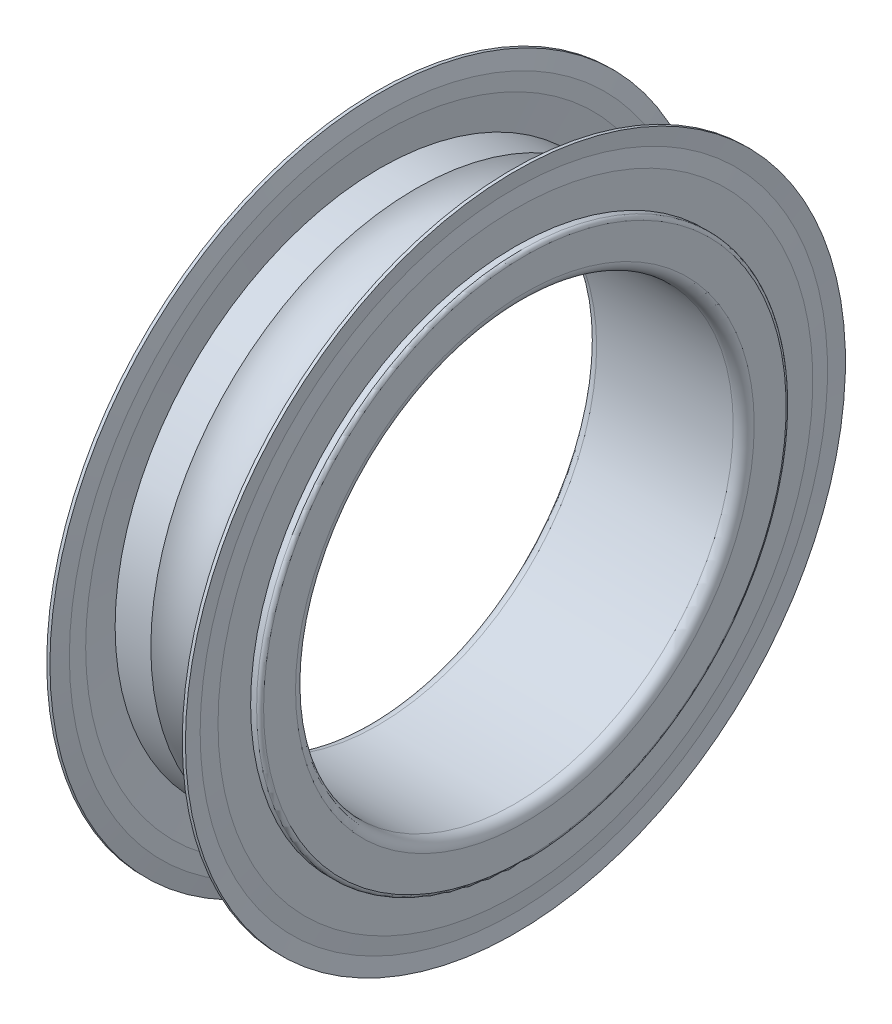
ISO-10303-21;
HEADER;
FILE_DESCRIPTION(('STEP AP214'),'2;1');
FILE_NAME('part.step','',(''),(''),'','','');
FILE_SCHEMA(('AUTOMOTIVE_DESIGN { 1 0 10303 214 1 1 1 1 }'));
ENDSEC;
DATA;
#1=APPLICATION_CONTEXT('core data for automotive mechanical design processes');
#2=APPLICATION_PROTOCOL_DEFINITION('international standard','automotive_design',2000,#1);
#3=PRODUCT_CONTEXT('',#1,'mechanical');
#4=PRODUCT('Part','Part','',(#3));
#5=PRODUCT_RELATED_PRODUCT_CATEGORY('part','',(#4));
#6=PRODUCT_DEFINITION_FORMATION('','',#4);
#7=PRODUCT_DEFINITION_CONTEXT('part definition',#1,'design');
#8=PRODUCT_DEFINITION('design','',#6,#7);
#9=PRODUCT_DEFINITION_SHAPE('','',#8);
#10=(LENGTH_UNIT() NAMED_UNIT(*) SI_UNIT(.MILLI.,.METRE.));
#11=(NAMED_UNIT(*) PLANE_ANGLE_UNIT() SI_UNIT($,.RADIAN.));
#12=(NAMED_UNIT(*) SI_UNIT($,.STERADIAN.) SOLID_ANGLE_UNIT());
#13=UNCERTAINTY_MEASURE_WITH_UNIT(LENGTH_MEASURE(1.E-05),#10,'distance_accuracy_value','');
#14=(GEOMETRIC_REPRESENTATION_CONTEXT(3) GLOBAL_UNCERTAINTY_ASSIGNED_CONTEXT((#13)) GLOBAL_UNIT_ASSIGNED_CONTEXT((#10,
#11,#12)) REPRESENTATION_CONTEXT('',''));
#15=CARTESIAN_POINT('',(0.,0.,0.));
#16=DIRECTION('',(0.,0.,1.));
#17=DIRECTION('',(1.,0.,0.));
#18=AXIS2_PLACEMENT_3D('',#15,#16,#17);
#19=CARTESIAN_POINT('',(50.,0.,0.));
#20=DIRECTION('',(-1.,0.,0.));
#21=DIRECTION('',(0.,0.,1.));
#22=AXIS2_PLACEMENT_3D('',#19,#20,#21);
#23=CYLINDRICAL_SURFACE('',#22,15.125);
#24=CARTESIAN_POINT('',(6.2402689447324,0.,0.));
#25=DIRECTION('',(-1.,0.,0.));
#26=DIRECTION('',(0.,0.,1.));
#27=AXIS2_PLACEMENT_3D('',#24,#25,#26);
#28=CIRCLE('',#27,15.125);
#29=CARTESIAN_POINT('',(6.2402689447324,0.,15.125));
#30=VERTEX_POINT('',#29);
#31=EDGE_CURVE('E76',#30,#30,#28,.T.);
#32=ORIENTED_EDGE('',*,*,#31,.F.);
#33=EDGE_LOOP('',(#32));
#34=FACE_BOUND('',#33,.T.);
#35=CARTESIAN_POINT('',(8.28,0.,0.));
#36=DIRECTION('',(-1.,0.,0.));
#37=DIRECTION('',(0.,0.,1.));
#38=AXIS2_PLACEMENT_3D('',#35,#36,#37);
#39=CIRCLE('',#38,15.125);
#40=CARTESIAN_POINT('',(8.28,0.,15.125));
#41=VERTEX_POINT('',#40);
#42=EDGE_CURVE('E10',#41,#41,#39,.F.);
#43=ORIENTED_EDGE('',*,*,#42,.F.);
#44=EDGE_LOOP('',(#43));
#45=FACE_BOUND('',#44,.T.);
#46=ADVANCED_FACE('F35',(#34,#45),#23,.T.);
#47=CARTESIAN_POINT('',(8.8,0.,0.));
#48=DIRECTION('',(-1.,0.,0.));
#49=DIRECTION('',(0.,0.,1.));
#50=AXIS2_PLACEMENT_3D('',#47,#48,#49);
#51=CIRCLE('',#50,15.125);
#52=CARTESIAN_POINT('',(8.8,0.,15.125));
#53=VERTEX_POINT('',#52);
#54=EDGE_CURVE('E73',#53,#53,#51,.T.);
#55=ORIENTED_EDGE('',*,*,#54,.T.);
#56=EDGE_LOOP('',(#55));
#57=FACE_BOUND('',#56,.T.);
#58=CARTESIAN_POINT('',(8.46,0.,0.));
#59=DIRECTION('',(-1.,0.,0.));
#60=DIRECTION('',(0.,0.,1.));
#61=AXIS2_PLACEMENT_3D('',#58,#59,#60);
#62=CIRCLE('',#61,15.125);
#63=CARTESIAN_POINT('',(8.46,0.,15.125));
#64=VERTEX_POINT('',#63);
#65=EDGE_CURVE('E42',#64,#64,#62,.T.);
#66=ORIENTED_EDGE('',*,*,#65,.F.);
#67=EDGE_LOOP('',(#66));
#68=FACE_BOUND('',#67,.T.);
#69=ADVANCED_FACE('F157',(#57,#68),#23,.T.);
#70=CARTESIAN_POINT('',(50.,0.,0.));
#71=DIRECTION('',(-1.,0.,0.));
#72=DIRECTION('',(0.,0.,1.));
#73=AXIS2_PLACEMENT_3D('',#70,#71,#72);
#74=CYLINDRICAL_SURFACE('',#73,15.125);
#75=CARTESIAN_POINT('',(0.199999999999999,0.,0.));
#76=DIRECTION('',(-1.,0.,0.));
#77=DIRECTION('',(0.,0.,1.));
#78=AXIS2_PLACEMENT_3D('',#75,#76,#77);
#79=CIRCLE('',#78,15.125);
#80=CARTESIAN_POINT('',(0.199999999999999,0.,15.125));
#81=VERTEX_POINT('',#80);
#82=EDGE_CURVE('E82',#81,#81,#79,.T.);
#83=ORIENTED_EDGE('',*,*,#82,.F.);
#84=EDGE_LOOP('',(#83));
#85=FACE_BOUND('',#84,.T.);
#86=CARTESIAN_POINT('',(0.539999999999999,0.,0.));
#87=DIRECTION('',(1.,0.,0.));
#88=DIRECTION('',(0.,0.,-1.));
#89=AXIS2_PLACEMENT_3D('',#86,#87,#88);
#90=CIRCLE('',#89,15.125);
#91=CARTESIAN_POINT('',(0.539999999999999,0.,-15.125));
#92=VERTEX_POINT('',#91);
#93=EDGE_CURVE('E46',#92,#92,#90,.T.);
#94=ORIENTED_EDGE('',*,*,#93,.F.);
#95=EDGE_LOOP('',(#94));
#96=FACE_BOUND('',#95,.T.);
#97=ADVANCED_FACE('F163',(#85,#96),#74,.T.);
#98=CARTESIAN_POINT('',(2.7597310552676,0.,0.));
#99=DIRECTION('',(-1.,0.,0.));
#100=DIRECTION('',(0.,0.,1.));
#101=AXIS2_PLACEMENT_3D('',#98,#99,#100);
#102=CIRCLE('',#101,15.125);
#103=CARTESIAN_POINT('',(2.7597310552676,0.,15.125));
#104=VERTEX_POINT('',#103);
#105=EDGE_CURVE('E79',#104,#104,#102,.T.);
#106=ORIENTED_EDGE('',*,*,#105,.T.);
#107=EDGE_LOOP('',(#106));
#108=FACE_BOUND('',#107,.T.);
#109=CARTESIAN_POINT('',(0.719999999999998,0.,0.));
#110=DIRECTION('',(1.,0.,0.));
#111=DIRECTION('',(0.,0.,-1.));
#112=AXIS2_PLACEMENT_3D('',#109,#110,#111);
#113=CIRCLE('',#112,15.125);
#114=CARTESIAN_POINT('',(0.719999999999998,0.,-15.125));
#115=VERTEX_POINT('',#114);
#116=EDGE_CURVE('E50',#115,#115,#113,.F.);
#117=ORIENTED_EDGE('',*,*,#116,.F.);
#118=EDGE_LOOP('',(#117));
#119=FACE_BOUND('',#118,.T.);
#120=ADVANCED_FACE('F196',(#108,#119),#74,.T.);
#121=CARTESIAN_POINT('',(0.200000000000529,0.,0.));
#122=DIRECTION('',(-1.,0.,0.));
#123=DIRECTION('',(0.,0.,1.));
#124=AXIS2_PLACEMENT_3D('',#121,#122,#123);
#125=TOROIDAL_SURFACE('',#124,14.9249999999995,0.200000000000528);
#126=CARTESIAN_POINT('',(0.,0.,0.));
#127=DIRECTION('',(-1.,0.,0.));
#128=DIRECTION('',(0.,0.,1.));
#129=AXIS2_PLACEMENT_3D('',#126,#127,#128);
#130=CIRCLE('',#129,14.925);
#131=CARTESIAN_POINT('',(0.,0.,14.925));
#132=VERTEX_POINT('',#131);
#133=EDGE_CURVE('E55',#132,#132,#130,.T.);
#134=ORIENTED_EDGE('',*,*,#133,.F.);
#135=EDGE_LOOP('',(#134));
#136=FACE_BOUND('',#135,.T.);
#137=ORIENTED_EDGE('',*,*,#82,.T.);
#138=EDGE_LOOP('',(#137));
#139=FACE_BOUND('',#138,.T.);
#140=ADVANCED_FACE('F37',(#136,#139),#125,.T.);
#141=CARTESIAN_POINT('',(0.,14.925,0.));
#142=DIRECTION('',(1.,0.,0.));
#143=DIRECTION('',(0.,0.,-1.));
#144=AXIS2_PLACEMENT_3D('',#141,#142,#143);
#145=PLANE('',#144);
#146=CARTESIAN_POINT('',(0.,0.,0.));
#147=DIRECTION('',(-1.,0.,0.));
#148=DIRECTION('',(0.,0.,1.));
#149=AXIS2_PLACEMENT_3D('',#146,#147,#148);
#150=CIRCLE('',#149,13.1);
#151=CARTESIAN_POINT('',(0.,0.,13.1));
#152=VERTEX_POINT('',#151);
#153=EDGE_CURVE('E58',#152,#152,#150,.T.);
#154=ORIENTED_EDGE('',*,*,#153,.F.);
#155=EDGE_LOOP('',(#154));
#156=FACE_BOUND('',#155,.T.);
#157=ORIENTED_EDGE('',*,*,#133,.T.);
#158=EDGE_LOOP('',(#157));
#159=FACE_BOUND('',#158,.T.);
#160=ADVANCED_FACE('F189',(#156,#159),#145,.F.);
#161=CARTESIAN_POINT('',(0.599999999999874,0.,0.));
#162=DIRECTION('',(-1.,0.,0.));
#163=DIRECTION('',(0.,0.,1.));
#164=AXIS2_PLACEMENT_3D('',#161,#162,#163);
#165=TOROIDAL_SURFACE('',#164,13.0999999999999,0.599999999999874);
#166=CARTESIAN_POINT('',(0.600000000000003,0.,0.));
#167=DIRECTION('',(-1.,0.,0.));
#168=DIRECTION('',(0.,0.,1.));
#169=AXIS2_PLACEMENT_3D('',#166,#167,#168);
#170=CIRCLE('',#169,12.5);
#171=CARTESIAN_POINT('',(0.600000000000003,0.,12.5));
#172=VERTEX_POINT('',#171);
#173=EDGE_CURVE('E61',#172,#172,#170,.T.);
#174=ORIENTED_EDGE('',*,*,#173,.F.);
#175=EDGE_LOOP('',(#174));
#176=FACE_BOUND('',#175,.T.);
#177=ORIENTED_EDGE('',*,*,#153,.T.);
#178=EDGE_LOOP('',(#177));
#179=FACE_BOUND('',#178,.T.);
#180=ADVANCED_FACE('F186',(#176,#179),#165,.T.);
#181=CARTESIAN_POINT('',(50.,0.,0.));
#182=DIRECTION('',(-1.,0.,0.));
#183=DIRECTION('',(0.,0.,1.));
#184=AXIS2_PLACEMENT_3D('',#181,#182,#183);
#185=CYLINDRICAL_SURFACE('',#184,12.5);
#186=CARTESIAN_POINT('',(8.4,0.,0.));
#187=DIRECTION('',(-1.,0.,0.));
#188=DIRECTION('',(0.,0.,1.));
#189=AXIS2_PLACEMENT_3D('',#186,#187,#188);
#190=CIRCLE('',#189,12.5);
#191=CARTESIAN_POINT('',(8.4,0.,12.5));
#192=VERTEX_POINT('',#191);
#193=EDGE_CURVE('E64',#192,#192,#190,.T.);
#194=ORIENTED_EDGE('',*,*,#193,.F.);
#195=EDGE_LOOP('',(#194));
#196=FACE_BOUND('',#195,.T.);
#197=ORIENTED_EDGE('',*,*,#173,.T.);
#198=EDGE_LOOP('',(#197));
#199=FACE_BOUND('',#198,.T.);
#200=ADVANCED_FACE('F182',(#196,#199),#185,.F.);
#201=CARTESIAN_POINT('',(8.40000000000007,0.,0.));
#202=DIRECTION('',(-1.,0.,0.));
#203=DIRECTION('',(0.,0.,1.));
#204=AXIS2_PLACEMENT_3D('',#201,#202,#203);
#205=TOROIDAL_SURFACE('',#204,13.0999999999999,0.599999999999923);
#206=CARTESIAN_POINT('',(8.99999999999999,0.,0.));
#207=DIRECTION('',(-1.,0.,0.));
#208=DIRECTION('',(0.,0.,1.));
#209=AXIS2_PLACEMENT_3D('',#206,#207,#208);
#210=CIRCLE('',#209,13.0999999999999);
#211=CARTESIAN_POINT('',(8.99999999999999,0.,13.0999999999999));
#212=VERTEX_POINT('',#211);
#213=EDGE_CURVE('E67',#212,#212,#210,.T.);
#214=ORIENTED_EDGE('',*,*,#213,.F.);
#215=EDGE_LOOP('',(#214));
#216=FACE_BOUND('',#215,.T.);
#217=ORIENTED_EDGE('',*,*,#193,.T.);
#218=EDGE_LOOP('',(#217));
#219=FACE_BOUND('',#218,.T.);
#220=ADVANCED_FACE('F178',(#216,#219),#205,.T.);
#221=CARTESIAN_POINT('',(9.,13.1,0.));
#222=DIRECTION('',(-1.,0.,0.));
#223=DIRECTION('',(0.,0.,1.));
#224=AXIS2_PLACEMENT_3D('',#221,#222,#223);
#225=PLANE('',#224);
#226=CARTESIAN_POINT('',(9.,0.,0.));
#227=DIRECTION('',(-1.,0.,0.));
#228=DIRECTION('',(0.,0.,1.));
#229=AXIS2_PLACEMENT_3D('',#226,#227,#228);
#230=CIRCLE('',#229,14.925);
#231=CARTESIAN_POINT('',(9.,0.,14.925));
#232=VERTEX_POINT('',#231);
#233=EDGE_CURVE('E70',#232,#232,#230,.T.);
#234=ORIENTED_EDGE('',*,*,#233,.F.);
#235=EDGE_LOOP('',(#234));
#236=FACE_BOUND('',#235,.T.);
#237=ORIENTED_EDGE('',*,*,#213,.T.);
#238=EDGE_LOOP('',(#237));
#239=FACE_BOUND('',#238,.T.);
#240=ADVANCED_FACE('F174',(#236,#239),#225,.F.);
#241=CARTESIAN_POINT('',(8.79999999999946,0.,0.));
#242=DIRECTION('',(-1.,0.,0.));
#243=DIRECTION('',(0.,0.,1.));
#244=AXIS2_PLACEMENT_3D('',#241,#242,#243);
#245=TOROIDAL_SURFACE('',#244,14.9249999999995,0.200000000000543);
#246=ORIENTED_EDGE('',*,*,#54,.F.);
#247=EDGE_LOOP('',(#246));
#248=FACE_BOUND('',#247,.T.);
#249=ORIENTED_EDGE('',*,*,#233,.T.);
#250=EDGE_LOOP('',(#249));
#251=FACE_BOUND('',#250,.T.);
#252=ADVANCED_FACE('F171',(#248,#251),#245,.T.);
#253=CARTESIAN_POINT('',(4.5,0.,0.));
#254=DIRECTION('',(-1.,0.,0.));
#255=DIRECTION('',(0.,0.,1.));
#256=AXIS2_PLACEMENT_3D('',#253,#254,#255);
#257=TOROIDAL_SURFACE('',#256,16.75,2.38100000000001);
#258=ORIENTED_EDGE('',*,*,#105,.F.);
#259=EDGE_LOOP('',(#258));
#260=FACE_BOUND('',#259,.T.);
#261=ORIENTED_EDGE('',*,*,#31,.T.);
#262=EDGE_LOOP('',(#261));
#263=FACE_BOUND('',#262,.T.);
#264=ADVANCED_FACE('F169',(#260,#263),#257,.F.);
#265=CARTESIAN_POINT('',(50.,0.,0.));
#266=DIRECTION('',(-1.,0.,0.));
#267=DIRECTION('',(0.,0.,1.));
#268=AXIS2_PLACEMENT_3D('',#265,#266,#267);
#269=CYLINDRICAL_SURFACE('',#268,18.85);
#270=CARTESIAN_POINT('',(0.539999999999999,0.,0.));
#271=DIRECTION('',(-1.,0.,0.));
#272=DIRECTION('',(0.,0.,1.));
#273=AXIS2_PLACEMENT_3D('',#270,#271,#272);
#274=CIRCLE('',#273,18.85);
#275=CARTESIAN_POINT('',(0.539999999999999,0.,18.85));
#276=VERTEX_POINT('',#275);
#277=EDGE_CURVE('E85',#276,#276,#274,.T.);
#278=ORIENTED_EDGE('',*,*,#277,.F.);
#279=EDGE_LOOP('',(#278));
#280=FACE_BOUND('',#279,.T.);
#281=CARTESIAN_POINT('',(0.719999999999998,0.,0.));
#282=DIRECTION('',(-1.,0.,0.));
#283=DIRECTION('',(0.,0.,1.));
#284=AXIS2_PLACEMENT_3D('',#281,#282,#283);
#285=CIRCLE('',#284,18.85);
#286=CARTESIAN_POINT('',(0.719999999999998,0.,18.85));
#287=VERTEX_POINT('',#286);
#288=EDGE_CURVE('E100',#287,#287,#285,.T.);
#289=ORIENTED_EDGE('',*,*,#288,.T.);
#290=EDGE_LOOP('',(#289));
#291=FACE_BOUND('',#290,.T.);
#292=ADVANCED_FACE('F224',(#280,#291),#269,.T.);
#293=CARTESIAN_POINT('',(0.539999999999999,0.,0.));
#294=DIRECTION('',(-1.,0.,0.));
#295=DIRECTION('',(0.,0.,1.));
#296=AXIS2_PLACEMENT_3D('',#293,#294,#295);
#297=CONICAL_SURFACE('',#296,18.85,1.4744512462193);
#298=CARTESIAN_POINT('',(0.629999999999999,0.,0.));
#299=DIRECTION('',(-1.,0.,0.));
#300=DIRECTION('',(0.,0.,1.));
#301=AXIS2_PLACEMENT_3D('',#298,#299,#300);
#302=CIRCLE('',#301,17.91875);
#303=CARTESIAN_POINT('',(0.629999999999999,0.,17.91875));
#304=VERTEX_POINT('',#303);
#305=EDGE_CURVE('E88',#304,#304,#302,.T.);
#306=ORIENTED_EDGE('',*,*,#305,.F.);
#307=EDGE_LOOP('',(#306));
#308=FACE_BOUND('',#307,.T.);
#309=ORIENTED_EDGE('',*,*,#277,.T.);
#310=EDGE_LOOP('',(#309));
#311=FACE_BOUND('',#310,.T.);
#312=ADVANCED_FACE('F218',(#308,#311),#297,.F.);
#313=CARTESIAN_POINT('',(0.629999999999999,0.,0.));
#314=DIRECTION('',(1.,0.,0.));
#315=DIRECTION('',(0.,0.,-1.));
#316=AXIS2_PLACEMENT_3D('',#313,#314,#315);
#317=CONICAL_SURFACE('',#316,17.91875,1.4744512462193);
#318=CARTESIAN_POINT('',(0.539999999999999,0.,0.));
#319=DIRECTION('',(-1.,0.,0.));
#320=DIRECTION('',(0.,0.,1.));
#321=AXIS2_PLACEMENT_3D('',#318,#319,#320);
#322=CIRCLE('',#321,16.9875);
#323=CARTESIAN_POINT('',(0.539999999999999,0.,16.9875));
#324=VERTEX_POINT('',#323);
#325=EDGE_CURVE('E91',#324,#324,#322,.T.);
#326=ORIENTED_EDGE('',*,*,#325,.F.);
#327=EDGE_LOOP('',(#326));
#328=FACE_BOUND('',#327,.T.);
#329=ORIENTED_EDGE('',*,*,#305,.T.);
#330=EDGE_LOOP('',(#329));
#331=FACE_BOUND('',#330,.T.);
#332=ADVANCED_FACE('F212',(#328,#331),#317,.T.);
#333=CARTESIAN_POINT('',(0.54,16.9875,0.));
#334=DIRECTION('',(1.,0.,0.));
#335=DIRECTION('',(0.,0.,-1.));
#336=AXIS2_PLACEMENT_3D('',#333,#334,#335);
#337=PLANE('',#336);
#338=ORIENTED_EDGE('',*,*,#93,.T.);
#339=EDGE_LOOP('',(#338));
#340=FACE_BOUND('',#339,.T.);
#341=ORIENTED_EDGE('',*,*,#325,.T.);
#342=EDGE_LOOP('',(#341));
#343=FACE_BOUND('',#342,.T.);
#344=ADVANCED_FACE('F208',(#340,#343),#337,.F.);
#345=CARTESIAN_POINT('',(0.719999999999998,0.,0.));
#346=DIRECTION('',(1.,0.,0.));
#347=DIRECTION('',(0.,0.,-1.));
#348=AXIS2_PLACEMENT_3D('',#345,#346,#347);
#349=CONICAL_SURFACE('',#348,15.125,1.4744512462193);
#350=CARTESIAN_POINT('',(0.899999999999998,0.,0.));
#351=DIRECTION('',(-1.,0.,0.));
#352=DIRECTION('',(0.,0.,1.));
#353=AXIS2_PLACEMENT_3D('',#350,#351,#352);
#354=CIRCLE('',#353,16.9875);
#355=CARTESIAN_POINT('',(0.899999999999998,0.,16.9875));
#356=VERTEX_POINT('',#355);
#357=EDGE_CURVE('E94',#356,#356,#354,.T.);
#358=ORIENTED_EDGE('',*,*,#357,.F.);
#359=EDGE_LOOP('',(#358));
#360=FACE_BOUND('',#359,.T.);
#361=ORIENTED_EDGE('',*,*,#116,.T.);
#362=EDGE_LOOP('',(#361));
#363=FACE_BOUND('',#362,.T.);
#364=ADVANCED_FACE('F211',(#360,#363),#349,.F.);
#365=CARTESIAN_POINT('',(0.9,16.9875,0.));
#366=DIRECTION('',(-1.,0.,0.));
#367=DIRECTION('',(0.,0.,1.));
#368=AXIS2_PLACEMENT_3D('',#365,#366,#367);
#369=PLANE('',#368);
#370=CARTESIAN_POINT('',(0.899999999999998,0.,0.));
#371=DIRECTION('',(-1.,0.,0.));
#372=DIRECTION('',(0.,0.,1.));
#373=AXIS2_PLACEMENT_3D('',#370,#371,#372);
#374=CIRCLE('',#373,17.91875);
#375=CARTESIAN_POINT('',(0.899999999999998,0.,17.91875));
#376=VERTEX_POINT('',#375);
#377=EDGE_CURVE('E97',#376,#376,#374,.T.);
#378=ORIENTED_EDGE('',*,*,#377,.F.);
#379=EDGE_LOOP('',(#378));
#380=FACE_BOUND('',#379,.T.);
#381=ORIENTED_EDGE('',*,*,#357,.T.);
#382=EDGE_LOOP('',(#381));
#383=FACE_BOUND('',#382,.T.);
#384=ADVANCED_FACE('F236',(#380,#383),#369,.F.);
#385=CARTESIAN_POINT('',(0.899999999999998,0.,0.));
#386=DIRECTION('',(-1.,0.,0.));
#387=DIRECTION('',(0.,0.,1.));
#388=AXIS2_PLACEMENT_3D('',#385,#386,#387);
#389=CONICAL_SURFACE('',#388,17.91875,1.37986229500683);
#390=ORIENTED_EDGE('',*,*,#288,.F.);
#391=EDGE_LOOP('',(#390));
#392=FACE_BOUND('',#391,.T.);
#393=ORIENTED_EDGE('',*,*,#377,.T.);
#394=EDGE_LOOP('',(#393));
#395=FACE_BOUND('',#394,.T.);
#396=ADVANCED_FACE('F233',(#392,#395),#389,.T.);
#397=CARTESIAN_POINT('',(8.1,17.91875,0.));
#398=DIRECTION('',(1.,0.,0.));
#399=DIRECTION('',(0.,0.,-1.));
#400=AXIS2_PLACEMENT_3D('',#397,#398,#399);
#401=PLANE('',#400);
#402=CARTESIAN_POINT('',(8.1,0.,0.));
#403=DIRECTION('',(-1.,0.,0.));
#404=DIRECTION('',(0.,0.,1.));
#405=AXIS2_PLACEMENT_3D('',#402,#403,#404);
#406=CIRCLE('',#405,16.9875);
#407=CARTESIAN_POINT('',(8.1,0.,16.9875));
#408=VERTEX_POINT('',#407);
#409=EDGE_CURVE('E103',#408,#408,#406,.T.);
#410=ORIENTED_EDGE('',*,*,#409,.F.);
#411=EDGE_LOOP('',(#410));
#412=FACE_BOUND('',#411,.T.);
#413=CARTESIAN_POINT('',(8.1,0.,0.));
#414=DIRECTION('',(-1.,0.,0.));
#415=DIRECTION('',(0.,0.,1.));
#416=AXIS2_PLACEMENT_3D('',#413,#414,#415);
#417=CIRCLE('',#416,17.91875);
#418=CARTESIAN_POINT('',(8.1,0.,17.91875));
#419=VERTEX_POINT('',#418);
#420=EDGE_CURVE('E118',#419,#419,#417,.T.);
#421=ORIENTED_EDGE('',*,*,#420,.T.);
#422=EDGE_LOOP('',(#421));
#423=FACE_BOUND('',#422,.T.);
#424=ADVANCED_FACE('F122',(#412,#423),#401,.F.);
#425=CARTESIAN_POINT('',(8.1,0.,0.));
#426=DIRECTION('',(-1.,0.,0.));
#427=DIRECTION('',(0.,0.,1.));
#428=AXIS2_PLACEMENT_3D('',#425,#426,#427);
#429=CONICAL_SURFACE('',#428,16.9875,1.4744512462193);
#430=ORIENTED_EDGE('',*,*,#42,.T.);
#431=EDGE_LOOP('',(#430));
#432=FACE_BOUND('',#431,.T.);
#433=ORIENTED_EDGE('',*,*,#409,.T.);
#434=EDGE_LOOP('',(#433));
#435=FACE_BOUND('',#434,.T.);
#436=ADVANCED_FACE('F150',(#432,#435),#429,.F.);
#437=CARTESIAN_POINT('',(8.46,15.125,0.));
#438=DIRECTION('',(-1.,0.,0.));
#439=DIRECTION('',(0.,0.,1.));
#440=AXIS2_PLACEMENT_3D('',#437,#438,#439);
#441=PLANE('',#440);
#442=CARTESIAN_POINT('',(8.46,0.,0.));
#443=DIRECTION('',(-1.,0.,0.));
#444=DIRECTION('',(0.,0.,1.));
#445=AXIS2_PLACEMENT_3D('',#442,#443,#444);
#446=CIRCLE('',#445,16.9875);
#447=CARTESIAN_POINT('',(8.46,0.,16.9875));
#448=VERTEX_POINT('',#447);
#449=EDGE_CURVE('E106',#448,#448,#446,.T.);
#450=ORIENTED_EDGE('',*,*,#449,.F.);
#451=EDGE_LOOP('',(#450));
#452=FACE_BOUND('',#451,.T.);
#453=ORIENTED_EDGE('',*,*,#65,.T.);
#454=EDGE_LOOP('',(#453));
#455=FACE_BOUND('',#454,.T.);
#456=ADVANCED_FACE('F145',(#452,#455),#441,.F.);
#457=CARTESIAN_POINT('',(8.46,0.,0.));
#458=DIRECTION('',(-1.,0.,0.));
#459=DIRECTION('',(0.,0.,1.));
#460=AXIS2_PLACEMENT_3D('',#457,#458,#459);
#461=CONICAL_SURFACE('',#460,16.9875,1.4744512462193);
#462=CARTESIAN_POINT('',(8.37,0.,0.));
#463=DIRECTION('',(-1.,0.,0.));
#464=DIRECTION('',(0.,0.,1.));
#465=AXIS2_PLACEMENT_3D('',#462,#463,#464);
#466=CIRCLE('',#465,17.91875);
#467=CARTESIAN_POINT('',(8.37,0.,17.91875));
#468=VERTEX_POINT('',#467);
#469=EDGE_CURVE('E109',#468,#468,#466,.T.);
#470=ORIENTED_EDGE('',*,*,#469,.F.);
#471=EDGE_LOOP('',(#470));
#472=FACE_BOUND('',#471,.T.);
#473=ORIENTED_EDGE('',*,*,#449,.T.);
#474=EDGE_LOOP('',(#473));
#475=FACE_BOUND('',#474,.T.);
#476=ADVANCED_FACE('F139',(#472,#475),#461,.T.);
#477=CARTESIAN_POINT('',(8.37,0.,0.));
#478=DIRECTION('',(1.,0.,0.));
#479=DIRECTION('',(0.,0.,-1.));
#480=AXIS2_PLACEMENT_3D('',#477,#478,#479);
#481=CONICAL_SURFACE('',#480,17.91875,1.4744512462193);
#482=CARTESIAN_POINT('',(8.46,0.,0.));
#483=DIRECTION('',(-1.,0.,0.));
#484=DIRECTION('',(0.,0.,1.));
#485=AXIS2_PLACEMENT_3D('',#482,#483,#484);
#486=CIRCLE('',#485,18.85);
#487=CARTESIAN_POINT('',(8.46,0.,18.85));
#488=VERTEX_POINT('',#487);
#489=EDGE_CURVE('E112',#488,#488,#486,.T.);
#490=ORIENTED_EDGE('',*,*,#489,.F.);
#491=EDGE_LOOP('',(#490));
#492=FACE_BOUND('',#491,.T.);
#493=ORIENTED_EDGE('',*,*,#469,.T.);
#494=EDGE_LOOP('',(#493));
#495=FACE_BOUND('',#494,.T.);
#496=ADVANCED_FACE('F133',(#492,#495),#481,.F.);
#497=CARTESIAN_POINT('',(50.,0.,0.));
#498=DIRECTION('',(-1.,0.,0.));
#499=DIRECTION('',(0.,0.,1.));
#500=AXIS2_PLACEMENT_3D('',#497,#498,#499);
#501=CYLINDRICAL_SURFACE('',#500,18.85);
#502=CARTESIAN_POINT('',(8.28,0.,0.));
#503=DIRECTION('',(-1.,0.,0.));
#504=DIRECTION('',(0.,0.,1.));
#505=AXIS2_PLACEMENT_3D('',#502,#503,#504);
#506=CIRCLE('',#505,18.85);
#507=CARTESIAN_POINT('',(8.28,0.,18.85));
#508=VERTEX_POINT('',#507);
#509=EDGE_CURVE('E115',#508,#508,#506,.T.);
#510=ORIENTED_EDGE('',*,*,#509,.F.);
#511=EDGE_LOOP('',(#510));
#512=FACE_BOUND('',#511,.T.);
#513=ORIENTED_EDGE('',*,*,#489,.T.);
#514=EDGE_LOOP('',(#513));
#515=FACE_BOUND('',#514,.T.);
#516=ADVANCED_FACE('F127',(#512,#515),#501,.T.);
#517=CARTESIAN_POINT('',(8.28,0.,0.));
#518=DIRECTION('',(1.,0.,0.));
#519=DIRECTION('',(0.,0.,-1.));
#520=AXIS2_PLACEMENT_3D('',#517,#518,#519);
#521=CONICAL_SURFACE('',#520,18.85,1.37986229500683);
#522=ORIENTED_EDGE('',*,*,#420,.F.);
#523=EDGE_LOOP('',(#522));
#524=FACE_BOUND('',#523,.T.);
#525=ORIENTED_EDGE('',*,*,#509,.T.);
#526=EDGE_LOOP('',(#525));
#527=FACE_BOUND('',#526,.T.);
#528=ADVANCED_FACE('F124',(#524,#527),#521,.T.);
#529=CLOSED_SHELL('',(#46,#69,#97,#120,#140,#160,#180,#200,#220,#240,#252,#264,#292,#312,#332,
#344,#364,#384,#396,#424,#436,#456,#476,#496,#516,#528));
#530=MANIFOLD_SOLID_BREP('B2',#529);
#531=ADVANCED_BREP_SHAPE_REPRESENTATION('',(#18,#530),#14);
#532=SHAPE_DEFINITION_REPRESENTATION(#9,#531);
ENDSEC;
END-ISO-10303-21;
